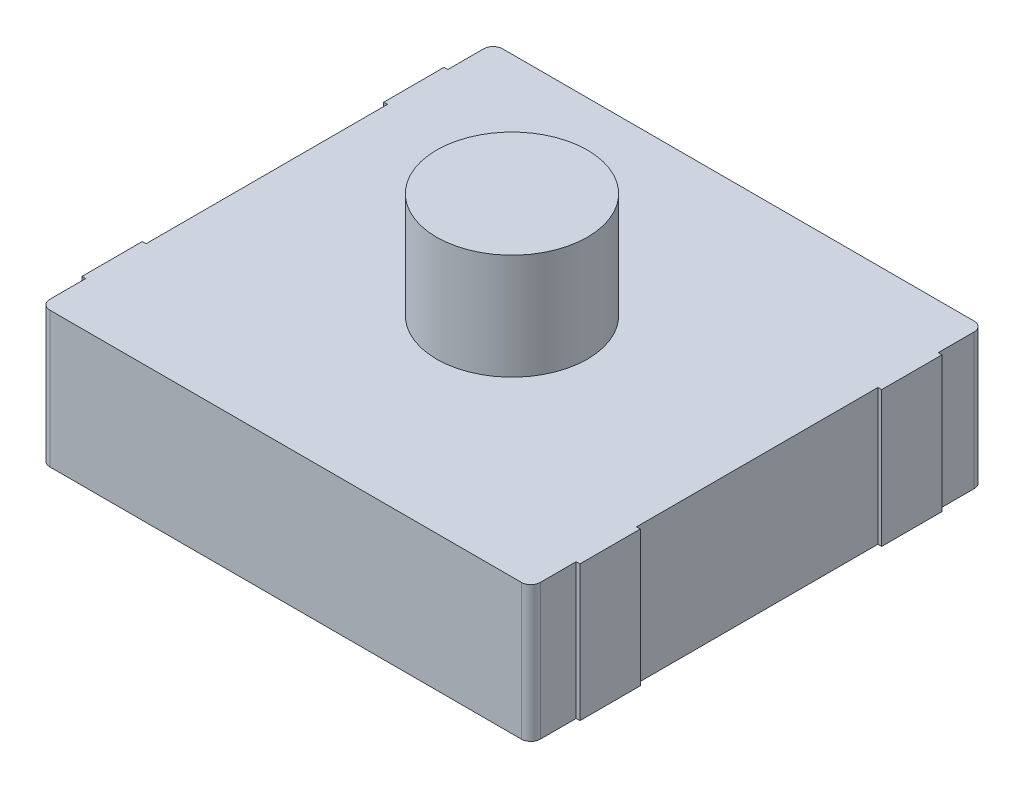
ISO-10303-21;
HEADER;
FILE_DESCRIPTION(('STEP AP214'),'2;1');
FILE_NAME('part.step','',(''),(''),'','','');
FILE_SCHEMA(('AUTOMOTIVE_DESIGN { 1 0 10303 214 1 1 1 1 }'));
ENDSEC;
DATA;
#1=APPLICATION_CONTEXT('core data for automotive mechanical design processes');
#2=APPLICATION_PROTOCOL_DEFINITION('international standard','automotive_design',2000,#1);
#3=PRODUCT_CONTEXT('',#1,'mechanical');
#4=PRODUCT('Part','Part','',(#3));
#5=PRODUCT_RELATED_PRODUCT_CATEGORY('part','',(#4));
#6=PRODUCT_DEFINITION_FORMATION('','',#4);
#7=PRODUCT_DEFINITION_CONTEXT('part definition',#1,'design');
#8=PRODUCT_DEFINITION('design','',#6,#7);
#9=PRODUCT_DEFINITION_SHAPE('','',#8);
#10=(LENGTH_UNIT() NAMED_UNIT(*) SI_UNIT(.MILLI.,.METRE.));
#11=(NAMED_UNIT(*) PLANE_ANGLE_UNIT() SI_UNIT($,.RADIAN.));
#12=(NAMED_UNIT(*) SI_UNIT($,.STERADIAN.) SOLID_ANGLE_UNIT());
#13=UNCERTAINTY_MEASURE_WITH_UNIT(LENGTH_MEASURE(1.E-05),#10,'distance_accuracy_value','');
#14=(GEOMETRIC_REPRESENTATION_CONTEXT(3) GLOBAL_UNCERTAINTY_ASSIGNED_CONTEXT((#13)) GLOBAL_UNIT_ASSIGNED_CONTEXT((#10,
#11,#12)) REPRESENTATION_CONTEXT('',''));
#15=CARTESIAN_POINT('',(0.,0.,0.));
#16=DIRECTION('',(0.,0.,1.));
#17=DIRECTION('',(1.,0.,0.));
#18=AXIS2_PLACEMENT_3D('',#15,#16,#17);
#19=CARTESIAN_POINT('',(0.,1.8,0.));
#20=DIRECTION('',(0.,1.,0.));
#21=DIRECTION('',(0.,0.,1.));
#22=AXIS2_PLACEMENT_3D('',#19,#20,#21);
#23=PLANE('',#22);
#24=DIRECTION('',(0.,0.,-1.));
#25=VECTOR('',#24,1.);
#26=CARTESIAN_POINT('',(3.25,1.8,-3.));
#27=LINE('',#26,#25);
#28=CARTESIAN_POINT('',(3.25,1.8,-2.4));
#29=VERTEX_POINT('',#28);
#30=CARTESIAN_POINT('',(3.25,1.8,-2.875));
#31=VERTEX_POINT('',#30);
#32=EDGE_CURVE('E330',#29,#31,#27,.T.);
#33=ORIENTED_EDGE('',*,*,#32,.T.);
#34=CARTESIAN_POINT('',(3.125,1.8,-2.875));
#35=DIRECTION('',(0.,1.,0.));
#36=DIRECTION('',(0.,0.,1.));
#37=AXIS2_PLACEMENT_3D('',#34,#35,#36);
#38=CIRCLE('',#37,0.125);
#39=CARTESIAN_POINT('',(3.125,1.8,-3.));
#40=VERTEX_POINT('',#39);
#41=EDGE_CURVE('E369',#31,#40,#38,.T.);
#42=ORIENTED_EDGE('',*,*,#41,.T.);
#43=DIRECTION('',(-1.,0.,0.));
#44=VECTOR('',#43,1.);
#45=CARTESIAN_POINT('',(-3.25,1.8,-3.));
#46=LINE('',#45,#44);
#47=CARTESIAN_POINT('',(-3.125,1.8,-3.));
#48=VERTEX_POINT('',#47);
#49=EDGE_CURVE('E333',#40,#48,#46,.T.);
#50=ORIENTED_EDGE('',*,*,#49,.T.);
#51=CARTESIAN_POINT('',(-3.125,1.8,-2.875));
#52=DIRECTION('',(0.,1.,0.));
#53=DIRECTION('',(0.,0.,1.));
#54=AXIS2_PLACEMENT_3D('',#51,#52,#53);
#55=CIRCLE('',#54,0.125);
#56=CARTESIAN_POINT('',(-3.25,1.8,-2.875));
#57=VERTEX_POINT('',#56);
#58=EDGE_CURVE('E367',#48,#57,#55,.T.);
#59=ORIENTED_EDGE('',*,*,#58,.T.);
#60=DIRECTION('',(0.,0.,1.));
#61=VECTOR('',#60,1.);
#62=CARTESIAN_POINT('',(-3.25,1.8,-3.));
#63=LINE('',#62,#61);
#64=CARTESIAN_POINT('',(-3.25,1.8,-2.4));
#65=VERTEX_POINT('',#64);
#66=EDGE_CURVE('E324',#57,#65,#63,.T.);
#67=ORIENTED_EDGE('',*,*,#66,.T.);
#68=DIRECTION('',(1.,0.,0.));
#69=VECTOR('',#68,1.);
#70=CARTESIAN_POINT('',(-3.3,1.8,-2.4));
#71=LINE('',#70,#69);
#72=CARTESIAN_POINT('',(-3.3,1.8,-2.4));
#73=VERTEX_POINT('',#72);
#74=EDGE_CURVE('E272',#73,#65,#71,.T.);
#75=ORIENTED_EDGE('',*,*,#74,.F.);
#76=DIRECTION('',(0.,0.,-1.));
#77=VECTOR('',#76,1.);
#78=CARTESIAN_POINT('',(-3.3,1.8,-1.6));
#79=LINE('',#78,#77);
#80=CARTESIAN_POINT('',(-3.3,1.8,-1.6));
#81=VERTEX_POINT('',#80);
#82=EDGE_CURVE('E281',#81,#73,#79,.T.);
#83=ORIENTED_EDGE('',*,*,#82,.F.);
#84=DIRECTION('',(-1.,0.,0.));
#85=VECTOR('',#84,1.);
#86=CARTESIAN_POINT('',(-3.3,1.8,-1.6));
#87=LINE('',#86,#85);
#88=CARTESIAN_POINT('',(-3.25,1.8,-1.6));
#89=VERTEX_POINT('',#88);
#90=EDGE_CURVE('E280',#89,#81,#87,.T.);
#91=ORIENTED_EDGE('',*,*,#90,.F.);
#92=CARTESIAN_POINT('',(-3.25,1.8,1.6));
#93=VERTEX_POINT('',#92);
#94=EDGE_CURVE('E327',#89,#93,#63,.T.);
#95=ORIENTED_EDGE('',*,*,#94,.T.);
#96=DIRECTION('',(1.,0.,0.));
#97=VECTOR('',#96,1.);
#98=CARTESIAN_POINT('',(-3.3,1.8,1.6));
#99=LINE('',#98,#97);
#100=CARTESIAN_POINT('',(-3.3,1.8,1.6));
#101=VERTEX_POINT('',#100);
#102=EDGE_CURVE('E299',#101,#93,#99,.T.);
#103=ORIENTED_EDGE('',*,*,#102,.F.);
#104=DIRECTION('',(0.,0.,-1.));
#105=VECTOR('',#104,1.);
#106=CARTESIAN_POINT('',(-3.3,1.8,2.4));
#107=LINE('',#106,#105);
#108=CARTESIAN_POINT('',(-3.3,1.8,2.4));
#109=VERTEX_POINT('',#108);
#110=EDGE_CURVE('E308',#109,#101,#107,.T.);
#111=ORIENTED_EDGE('',*,*,#110,.F.);
#112=DIRECTION('',(-1.,0.,0.));
#113=VECTOR('',#112,1.);
#114=CARTESIAN_POINT('',(-3.3,1.8,2.4));
#115=LINE('',#114,#113);
#116=CARTESIAN_POINT('',(-3.25,1.8,2.4));
#117=VERTEX_POINT('',#116);
#118=EDGE_CURVE('E307',#117,#109,#115,.T.);
#119=ORIENTED_EDGE('',*,*,#118,.F.);
#120=CARTESIAN_POINT('',(-3.25,1.8,2.875));
#121=VERTEX_POINT('',#120);
#122=EDGE_CURVE('E328',#117,#121,#63,.T.);
#123=ORIENTED_EDGE('',*,*,#122,.T.);
#124=CARTESIAN_POINT('',(-3.125,1.8,2.875));
#125=DIRECTION('',(0.,1.,0.));
#126=DIRECTION('',(0.,0.,1.));
#127=AXIS2_PLACEMENT_3D('',#124,#125,#126);
#128=CIRCLE('',#127,0.125);
#129=CARTESIAN_POINT('',(-3.125,1.8,3.));
#130=VERTEX_POINT('',#129);
#131=EDGE_CURVE('E57',#121,#130,#128,.T.);
#132=ORIENTED_EDGE('',*,*,#131,.T.);
#133=DIRECTION('',(1.,0.,0.));
#134=VECTOR('',#133,1.);
#135=CARTESIAN_POINT('',(-3.25,1.8,3.));
#136=LINE('',#135,#134);
#137=CARTESIAN_POINT('',(3.125,1.8,3.));
#138=VERTEX_POINT('',#137);
#139=EDGE_CURVE('E326',#130,#138,#136,.T.);
#140=ORIENTED_EDGE('',*,*,#139,.T.);
#141=CARTESIAN_POINT('',(3.125,1.8,2.875));
#142=DIRECTION('',(0.,1.,0.));
#143=DIRECTION('',(0.,0.,1.));
#144=AXIS2_PLACEMENT_3D('',#141,#142,#143);
#145=CIRCLE('',#144,0.125);
#146=CARTESIAN_POINT('',(3.25,1.8,2.875));
#147=VERTEX_POINT('',#146);
#148=EDGE_CURVE('E364',#138,#147,#145,.T.);
#149=ORIENTED_EDGE('',*,*,#148,.T.);
#150=CARTESIAN_POINT('',(3.25,1.8,2.4));
#151=VERTEX_POINT('',#150);
#152=EDGE_CURVE('E331',#147,#151,#27,.T.);
#153=ORIENTED_EDGE('',*,*,#152,.T.);
#154=DIRECTION('',(-1.,0.,0.));
#155=VECTOR('',#154,1.);
#156=CARTESIAN_POINT('',(3.3,1.8,2.4));
#157=LINE('',#156,#155);
#158=CARTESIAN_POINT('',(3.3,1.8,2.4));
#159=VERTEX_POINT('',#158);
#160=EDGE_CURVE('E209',#159,#151,#157,.T.);
#161=ORIENTED_EDGE('',*,*,#160,.F.);
#162=DIRECTION('',(0.,0.,1.));
#163=VECTOR('',#162,1.);
#164=CARTESIAN_POINT('',(3.3,1.8,2.4));
#165=LINE('',#164,#163);
#166=CARTESIAN_POINT('',(3.3,1.8,1.6));
#167=VERTEX_POINT('',#166);
#168=EDGE_CURVE('E206',#167,#159,#165,.T.);
#169=ORIENTED_EDGE('',*,*,#168,.F.);
#170=DIRECTION('',(1.,0.,0.));
#171=VECTOR('',#170,1.);
#172=CARTESIAN_POINT('',(3.3,1.8,1.6));
#173=LINE('',#172,#171);
#174=CARTESIAN_POINT('',(3.25,1.8,1.6));
#175=VERTEX_POINT('',#174);
#176=EDGE_CURVE('E226',#175,#167,#173,.T.);
#177=ORIENTED_EDGE('',*,*,#176,.F.);
#178=CARTESIAN_POINT('',(3.25,1.8,-1.6));
#179=VERTEX_POINT('',#178);
#180=EDGE_CURVE('E334',#175,#179,#27,.T.);
#181=ORIENTED_EDGE('',*,*,#180,.T.);
#182=DIRECTION('',(-1.,0.,0.));
#183=VECTOR('',#182,1.);
#184=CARTESIAN_POINT('',(3.3,1.8,-1.6));
#185=LINE('',#184,#183);
#186=CARTESIAN_POINT('',(3.3,1.8,-1.6));
#187=VERTEX_POINT('',#186);
#188=EDGE_CURVE('E251',#187,#179,#185,.T.);
#189=ORIENTED_EDGE('',*,*,#188,.F.);
#190=DIRECTION('',(0.,0.,1.));
#191=VECTOR('',#190,1.);
#192=CARTESIAN_POINT('',(3.3,1.8,-1.6));
#193=LINE('',#192,#191);
#194=CARTESIAN_POINT('',(3.3,1.8,-2.4));
#195=VERTEX_POINT('',#194);
#196=EDGE_CURVE('E256',#195,#187,#193,.T.);
#197=ORIENTED_EDGE('',*,*,#196,.F.);
#198=DIRECTION('',(1.,0.,0.));
#199=VECTOR('',#198,1.);
#200=CARTESIAN_POINT('',(3.3,1.8,-2.4));
#201=LINE('',#200,#199);
#202=EDGE_CURVE('E246',#29,#195,#201,.T.);
#203=ORIENTED_EDGE('',*,*,#202,.F.);
#204=EDGE_LOOP('',(#33,#42,#50,#59,#67,#75,#83,#91,#95,#103,#111,#119,#123,#132,#140,#149,#153,
#161,#169,#177,#181,#189,#197,#203));
#205=FACE_BOUND('',#204,.T.);
#206=CARTESIAN_POINT('',(0.,1.8,0.));
#207=DIRECTION('',(0.,1.,0.));
#208=DIRECTION('',(0.,0.,1.));
#209=AXIS2_PLACEMENT_3D('',#206,#207,#208);
#210=CIRCLE('',#209,1.);
#211=CARTESIAN_POINT('',(0.,1.8,1.));
#212=VERTEX_POINT('',#211);
#213=EDGE_CURVE('E232',#212,#212,#210,.T.);
#214=ORIENTED_EDGE('',*,*,#213,.F.);
#215=EDGE_LOOP('',(#214));
#216=FACE_BOUND('',#215,.T.);
#217=ADVANCED_FACE('F35',(#205,#216),#23,.T.);
#218=CARTESIAN_POINT('',(3.25,1.8,-3.));
#219=DIRECTION('',(-1.,0.,0.));
#220=DIRECTION('',(0.,0.,1.));
#221=AXIS2_PLACEMENT_3D('',#218,#219,#220);
#222=PLANE('',#221);
#223=ORIENTED_EDGE('',*,*,#180,.F.);
#224=DIRECTION('',(0.,-1.,0.));
#225=VECTOR('',#224,1.);
#226=CARTESIAN_POINT('',(3.25,1.8,1.6));
#227=LINE('',#226,#225);
#228=CARTESIAN_POINT('',(3.25,0.,1.6));
#229=VERTEX_POINT('',#228);
#230=EDGE_CURVE('E239',#175,#229,#227,.T.);
#231=ORIENTED_EDGE('',*,*,#230,.T.);
#232=DIRECTION('',(0.,0.,-1.));
#233=VECTOR('',#232,1.);
#234=CARTESIAN_POINT('',(3.25,0.,-3.));
#235=LINE('',#234,#233);
#236=CARTESIAN_POINT('',(3.25,0.,-1.6));
#237=VERTEX_POINT('',#236);
#238=EDGE_CURVE('E347',#229,#237,#235,.T.);
#239=ORIENTED_EDGE('',*,*,#238,.T.);
#240=DIRECTION('',(0.,1.,0.));
#241=VECTOR('',#240,1.);
#242=CARTESIAN_POINT('',(3.25,1.8,-1.6));
#243=LINE('',#242,#241);
#244=EDGE_CURVE('E254',#237,#179,#243,.T.);
#245=ORIENTED_EDGE('',*,*,#244,.T.);
#246=EDGE_LOOP('',(#223,#231,#239,#245));
#247=FACE_BOUND('',#246,.T.);
#248=ADVANCED_FACE('F403',(#247),#222,.F.);
#249=CARTESIAN_POINT('',(3.25,0.,-2.4));
#250=VERTEX_POINT('',#249);
#251=CARTESIAN_POINT('',(3.25,0.,-2.875));
#252=VERTEX_POINT('',#251);
#253=EDGE_CURVE('E343',#250,#252,#235,.T.);
#254=ORIENTED_EDGE('',*,*,#253,.T.);
#255=DIRECTION('',(0.,-1.,0.));
#256=VECTOR('',#255,1.);
#257=CARTESIAN_POINT('',(3.25,1.8,-2.875));
#258=LINE('',#257,#256);
#259=EDGE_CURVE('E362',#252,#31,#258,.F.);
#260=ORIENTED_EDGE('',*,*,#259,.T.);
#261=ORIENTED_EDGE('',*,*,#32,.F.);
#262=DIRECTION('',(0.,-1.,0.));
#263=VECTOR('',#262,1.);
#264=CARTESIAN_POINT('',(3.25,1.8,-2.4));
#265=LINE('',#264,#263);
#266=EDGE_CURVE('E266',#29,#250,#265,.T.);
#267=ORIENTED_EDGE('',*,*,#266,.T.);
#268=EDGE_LOOP('',(#254,#260,#261,#267));
#269=FACE_BOUND('',#268,.T.);
#270=ADVANCED_FACE('F410',(#269),#222,.F.);
#271=CARTESIAN_POINT('',(-3.25,1.8,-3.));
#272=DIRECTION('',(1.,0.,0.));
#273=DIRECTION('',(0.,0.,-1.));
#274=AXIS2_PLACEMENT_3D('',#271,#272,#273);
#275=PLANE('',#274);
#276=ORIENTED_EDGE('',*,*,#66,.F.);
#277=DIRECTION('',(0.,-1.,0.));
#278=VECTOR('',#277,1.);
#279=CARTESIAN_POINT('',(-3.25,1.8,-2.875));
#280=LINE('',#279,#278);
#281=CARTESIAN_POINT('',(-3.25,0.,-2.875));
#282=VERTEX_POINT('',#281);
#283=EDGE_CURVE('E371',#57,#282,#280,.T.);
#284=ORIENTED_EDGE('',*,*,#283,.T.);
#285=DIRECTION('',(0.,0.,1.));
#286=VECTOR('',#285,1.);
#287=CARTESIAN_POINT('',(-3.25,0.,-3.));
#288=LINE('',#287,#286);
#289=CARTESIAN_POINT('',(-3.25,0.,-2.4));
#290=VERTEX_POINT('',#289);
#291=EDGE_CURVE('E338',#282,#290,#288,.T.);
#292=ORIENTED_EDGE('',*,*,#291,.T.);
#293=DIRECTION('',(0.,1.,0.));
#294=VECTOR('',#293,1.);
#295=CARTESIAN_POINT('',(-3.25,1.8,-2.4));
#296=LINE('',#295,#294);
#297=EDGE_CURVE('E293',#290,#65,#296,.T.);
#298=ORIENTED_EDGE('',*,*,#297,.T.);
#299=EDGE_LOOP('',(#276,#284,#292,#298));
#300=FACE_BOUND('',#299,.T.);
#301=ADVANCED_FACE('F427',(#300),#275,.F.);
#302=ORIENTED_EDGE('',*,*,#94,.F.);
#303=DIRECTION('',(0.,-1.,0.));
#304=VECTOR('',#303,1.);
#305=CARTESIAN_POINT('',(-3.25,1.8,-1.6));
#306=LINE('',#305,#304);
#307=CARTESIAN_POINT('',(-3.25,0.,-1.6));
#308=VERTEX_POINT('',#307);
#309=EDGE_CURVE('E290',#89,#308,#306,.T.);
#310=ORIENTED_EDGE('',*,*,#309,.T.);
#311=CARTESIAN_POINT('',(-3.25,0.,1.6));
#312=VERTEX_POINT('',#311);
#313=EDGE_CURVE('E341',#308,#312,#288,.T.);
#314=ORIENTED_EDGE('',*,*,#313,.T.);
#315=DIRECTION('',(0.,1.,0.));
#316=VECTOR('',#315,1.);
#317=CARTESIAN_POINT('',(-3.25,1.8,1.6));
#318=LINE('',#317,#316);
#319=EDGE_CURVE('E320',#312,#93,#318,.T.);
#320=ORIENTED_EDGE('',*,*,#319,.T.);
#321=EDGE_LOOP('',(#302,#310,#314,#320));
#322=FACE_BOUND('',#321,.T.);
#323=ADVANCED_FACE('F444',(#322),#275,.F.);
#324=CARTESIAN_POINT('',(-3.25,0.,2.4));
#325=VERTEX_POINT('',#324);
#326=CARTESIAN_POINT('',(-3.25,0.,2.875));
#327=VERTEX_POINT('',#326);
#328=EDGE_CURVE('E323',#325,#327,#288,.T.);
#329=ORIENTED_EDGE('',*,*,#328,.T.);
#330=DIRECTION('',(0.,-1.,0.));
#331=VECTOR('',#330,1.);
#332=CARTESIAN_POINT('',(-3.25,1.8,2.875));
#333=LINE('',#332,#331);
#334=EDGE_CURVE('E43',#327,#121,#333,.F.);
#335=ORIENTED_EDGE('',*,*,#334,.T.);
#336=ORIENTED_EDGE('',*,*,#122,.F.);
#337=DIRECTION('',(0.,-1.,0.));
#338=VECTOR('',#337,1.);
#339=CARTESIAN_POINT('',(-3.25,1.8,2.4));
#340=LINE('',#339,#338);
#341=EDGE_CURVE('E317',#117,#325,#340,.T.);
#342=ORIENTED_EDGE('',*,*,#341,.T.);
#343=EDGE_LOOP('',(#329,#335,#336,#342));
#344=FACE_BOUND('',#343,.T.);
#345=ADVANCED_FACE('F381',(#344),#275,.F.);
#346=CARTESIAN_POINT('',(-3.25,1.8,3.));
#347=DIRECTION('',(0.,0.,-1.));
#348=DIRECTION('',(-1.,0.,0.));
#349=AXIS2_PLACEMENT_3D('',#346,#347,#348);
#350=PLANE('',#349);
#351=ORIENTED_EDGE('',*,*,#139,.F.);
#352=DIRECTION('',(0.,-1.,0.));
#353=VECTOR('',#352,1.);
#354=CARTESIAN_POINT('',(-3.125,1.8,3.));
#355=LINE('',#354,#353);
#356=CARTESIAN_POINT('',(-3.125,0.,3.));
#357=VERTEX_POINT('',#356);
#358=EDGE_CURVE('E375',#130,#357,#355,.T.);
#359=ORIENTED_EDGE('',*,*,#358,.T.);
#360=DIRECTION('',(1.,0.,0.));
#361=VECTOR('',#360,1.);
#362=CARTESIAN_POINT('',(-3.25,0.,3.));
#363=LINE('',#362,#361);
#364=CARTESIAN_POINT('',(3.125,0.,3.));
#365=VERTEX_POINT('',#364);
#366=EDGE_CURVE('E340',#357,#365,#363,.T.);
#367=ORIENTED_EDGE('',*,*,#366,.T.);
#368=DIRECTION('',(0.,-1.,0.));
#369=VECTOR('',#368,1.);
#370=CARTESIAN_POINT('',(3.125,1.8,3.));
#371=LINE('',#370,#369);
#372=EDGE_CURVE('E50',#365,#138,#371,.F.);
#373=ORIENTED_EDGE('',*,*,#372,.T.);
#374=EDGE_LOOP('',(#351,#359,#367,#373));
#375=FACE_BOUND('',#374,.T.);
#376=ADVANCED_FACE('F391',(#375),#350,.F.);
#377=ORIENTED_EDGE('',*,*,#152,.F.);
#378=DIRECTION('',(0.,-1.,0.));
#379=VECTOR('',#378,1.);
#380=CARTESIAN_POINT('',(3.25,1.8,2.875));
#381=LINE('',#380,#379);
#382=CARTESIAN_POINT('',(3.25,0.,2.875));
#383=VERTEX_POINT('',#382);
#384=EDGE_CURVE('E11',#147,#383,#381,.T.);
#385=ORIENTED_EDGE('',*,*,#384,.T.);
#386=CARTESIAN_POINT('',(3.25,0.,2.4));
#387=VERTEX_POINT('',#386);
#388=EDGE_CURVE('E344',#383,#387,#235,.T.);
#389=ORIENTED_EDGE('',*,*,#388,.T.);
#390=DIRECTION('',(0.,1.,0.));
#391=VECTOR('',#390,1.);
#392=CARTESIAN_POINT('',(3.25,1.8,2.4));
#393=LINE('',#392,#391);
#394=EDGE_CURVE('E216',#387,#151,#393,.T.);
#395=ORIENTED_EDGE('',*,*,#394,.T.);
#396=EDGE_LOOP('',(#377,#385,#389,#395));
#397=FACE_BOUND('',#396,.T.);
#398=ADVANCED_FACE('F397',(#397),#222,.F.);
#399=CARTESIAN_POINT('',(-3.25,1.8,-3.));
#400=DIRECTION('',(0.,0.,1.));
#401=DIRECTION('',(1.,0.,0.));
#402=AXIS2_PLACEMENT_3D('',#399,#400,#401);
#403=PLANE('',#402);
#404=ORIENTED_EDGE('',*,*,#49,.F.);
#405=DIRECTION('',(0.,-1.,0.));
#406=VECTOR('',#405,1.);
#407=CARTESIAN_POINT('',(3.125,1.8,-3.));
#408=LINE('',#407,#406);
#409=CARTESIAN_POINT('',(3.125,0.,-3.));
#410=VERTEX_POINT('',#409);
#411=EDGE_CURVE('E351',#40,#410,#408,.T.);
#412=ORIENTED_EDGE('',*,*,#411,.T.);
#413=DIRECTION('',(-1.,0.,0.));
#414=VECTOR('',#413,1.);
#415=CARTESIAN_POINT('',(-3.25,0.,-3.));
#416=LINE('',#415,#414);
#417=CARTESIAN_POINT('',(-3.125,0.,-3.));
#418=VERTEX_POINT('',#417);
#419=EDGE_CURVE('E346',#410,#418,#416,.T.);
#420=ORIENTED_EDGE('',*,*,#419,.T.);
#421=DIRECTION('',(0.,-1.,0.));
#422=VECTOR('',#421,1.);
#423=CARTESIAN_POINT('',(-3.125,1.8,-3.));
#424=LINE('',#423,#422);
#425=EDGE_CURVE('E337',#418,#48,#424,.F.);
#426=ORIENTED_EDGE('',*,*,#425,.T.);
#427=EDGE_LOOP('',(#404,#412,#420,#426));
#428=FACE_BOUND('',#427,.T.);
#429=ADVANCED_FACE('F420',(#428),#403,.F.);
#430=CARTESIAN_POINT('',(0.,0.,0.));
#431=DIRECTION('',(0.,1.,0.));
#432=DIRECTION('',(0.,0.,1.));
#433=AXIS2_PLACEMENT_3D('',#430,#431,#432);
#434=PLANE('',#433);
#435=ORIENTED_EDGE('',*,*,#419,.F.);
#436=CARTESIAN_POINT('',(3.125,0.,-2.875));
#437=DIRECTION('',(0.,1.,0.));
#438=DIRECTION('',(0.,0.,1.));
#439=AXIS2_PLACEMENT_3D('',#436,#437,#438);
#440=CIRCLE('',#439,0.125);
#441=EDGE_CURVE('E360',#410,#252,#440,.F.);
#442=ORIENTED_EDGE('',*,*,#441,.T.);
#443=ORIENTED_EDGE('',*,*,#253,.F.);
#444=DIRECTION('',(1.,0.,0.));
#445=VECTOR('',#444,1.);
#446=CARTESIAN_POINT('',(3.3,0.,-2.4));
#447=LINE('',#446,#445);
#448=CARTESIAN_POINT('',(3.3,0.,-2.4));
#449=VERTEX_POINT('',#448);
#450=EDGE_CURVE('E247',#250,#449,#447,.T.);
#451=ORIENTED_EDGE('',*,*,#450,.T.);
#452=DIRECTION('',(0.,0.,1.));
#453=VECTOR('',#452,1.);
#454=CARTESIAN_POINT('',(3.3,0.,-1.6));
#455=LINE('',#454,#453);
#456=CARTESIAN_POINT('',(3.3,0.,-1.6));
#457=VERTEX_POINT('',#456);
#458=EDGE_CURVE('E243',#449,#457,#455,.T.);
#459=ORIENTED_EDGE('',*,*,#458,.T.);
#460=DIRECTION('',(-1.,0.,0.));
#461=VECTOR('',#460,1.);
#462=CARTESIAN_POINT('',(3.3,0.,-1.6));
#463=LINE('',#462,#461);
#464=EDGE_CURVE('E242',#457,#237,#463,.T.);
#465=ORIENTED_EDGE('',*,*,#464,.T.);
#466=ORIENTED_EDGE('',*,*,#238,.F.);
#467=DIRECTION('',(1.,0.,0.));
#468=VECTOR('',#467,1.);
#469=CARTESIAN_POINT('',(3.3,0.,1.6));
#470=LINE('',#469,#468);
#471=CARTESIAN_POINT('',(3.3,0.,1.6));
#472=VERTEX_POINT('',#471);
#473=EDGE_CURVE('E219',#229,#472,#470,.T.);
#474=ORIENTED_EDGE('',*,*,#473,.T.);
#475=DIRECTION('',(0.,0.,1.));
#476=VECTOR('',#475,1.);
#477=CARTESIAN_POINT('',(3.3,0.,2.4));
#478=LINE('',#477,#476);
#479=CARTESIAN_POINT('',(3.3,0.,2.4));
#480=VERTEX_POINT('',#479);
#481=EDGE_CURVE('E204',#472,#480,#478,.T.);
#482=ORIENTED_EDGE('',*,*,#481,.T.);
#483=DIRECTION('',(-1.,0.,0.));
#484=VECTOR('',#483,1.);
#485=CARTESIAN_POINT('',(3.3,0.,2.4));
#486=LINE('',#485,#484);
#487=EDGE_CURVE('E213',#480,#387,#486,.T.);
#488=ORIENTED_EDGE('',*,*,#487,.T.);
#489=ORIENTED_EDGE('',*,*,#388,.F.);
#490=CARTESIAN_POINT('',(3.125,0.,2.875));
#491=DIRECTION('',(0.,1.,0.));
#492=DIRECTION('',(0.,0.,1.));
#493=AXIS2_PLACEMENT_3D('',#490,#491,#492);
#494=CIRCLE('',#493,0.125);
#495=EDGE_CURVE('E354',#383,#365,#494,.F.);
#496=ORIENTED_EDGE('',*,*,#495,.T.);
#497=ORIENTED_EDGE('',*,*,#366,.F.);
#498=CARTESIAN_POINT('',(-3.125,0.,2.875));
#499=DIRECTION('',(0.,1.,0.));
#500=DIRECTION('',(0.,0.,1.));
#501=AXIS2_PLACEMENT_3D('',#498,#499,#500);
#502=CIRCLE('',#501,0.125);
#503=EDGE_CURVE('E356',#357,#327,#502,.F.);
#504=ORIENTED_EDGE('',*,*,#503,.T.);
#505=ORIENTED_EDGE('',*,*,#328,.F.);
#506=DIRECTION('',(-1.,0.,0.));
#507=VECTOR('',#506,1.);
#508=CARTESIAN_POINT('',(-3.3,0.,2.4));
#509=LINE('',#508,#507);
#510=CARTESIAN_POINT('',(-3.3,0.,2.4));
#511=VERTEX_POINT('',#510);
#512=EDGE_CURVE('E297',#325,#511,#509,.T.);
#513=ORIENTED_EDGE('',*,*,#512,.T.);
#514=DIRECTION('',(0.,0.,-1.));
#515=VECTOR('',#514,1.);
#516=CARTESIAN_POINT('',(-3.3,0.,2.4));
#517=LINE('',#516,#515);
#518=CARTESIAN_POINT('',(-3.3,0.,1.6));
#519=VERTEX_POINT('',#518);
#520=EDGE_CURVE('E296',#511,#519,#517,.T.);
#521=ORIENTED_EDGE('',*,*,#520,.T.);
#522=DIRECTION('',(1.,0.,0.));
#523=VECTOR('',#522,1.);
#524=CARTESIAN_POINT('',(-3.3,0.,1.6));
#525=LINE('',#524,#523);
#526=EDGE_CURVE('E300',#519,#312,#525,.T.);
#527=ORIENTED_EDGE('',*,*,#526,.T.);
#528=ORIENTED_EDGE('',*,*,#313,.F.);
#529=DIRECTION('',(-1.,0.,0.));
#530=VECTOR('',#529,1.);
#531=CARTESIAN_POINT('',(-3.3,0.,-1.6));
#532=LINE('',#531,#530);
#533=CARTESIAN_POINT('',(-3.3,0.,-1.6));
#534=VERTEX_POINT('',#533);
#535=EDGE_CURVE('E270',#308,#534,#532,.T.);
#536=ORIENTED_EDGE('',*,*,#535,.T.);
#537=DIRECTION('',(0.,0.,-1.));
#538=VECTOR('',#537,1.);
#539=CARTESIAN_POINT('',(-3.3,0.,-1.6));
#540=LINE('',#539,#538);
#541=CARTESIAN_POINT('',(-3.3,0.,-2.4));
#542=VERTEX_POINT('',#541);
#543=EDGE_CURVE('E269',#534,#542,#540,.T.);
#544=ORIENTED_EDGE('',*,*,#543,.T.);
#545=DIRECTION('',(1.,0.,0.));
#546=VECTOR('',#545,1.);
#547=CARTESIAN_POINT('',(-3.3,0.,-2.4));
#548=LINE('',#547,#546);
#549=EDGE_CURVE('E273',#542,#290,#548,.T.);
#550=ORIENTED_EDGE('',*,*,#549,.T.);
#551=ORIENTED_EDGE('',*,*,#291,.F.);
#552=CARTESIAN_POINT('',(-3.125,0.,-2.875));
#553=DIRECTION('',(0.,1.,0.));
#554=DIRECTION('',(0.,0.,1.));
#555=AXIS2_PLACEMENT_3D('',#552,#553,#554);
#556=CIRCLE('',#555,0.125);
#557=EDGE_CURVE('E358',#282,#418,#556,.F.);
#558=ORIENTED_EDGE('',*,*,#557,.T.);
#559=EDGE_LOOP('',(#435,#442,#443,#451,#459,#465,#466,#474,#482,#488,#489,#496,#497,#504,#505,
#513,#521,#527,#528,#536,#544,#550,#551,#558));
#560=FACE_BOUND('',#559,.T.);
#561=ADVANCED_FACE('F223',(#560),#434,.F.);
#562=CARTESIAN_POINT('',(-3.3,3.08062484748657,1.6));
#563=DIRECTION('',(0.,0.,-1.));
#564=DIRECTION('',(-1.,0.,0.));
#565=AXIS2_PLACEMENT_3D('',#562,#563,#564);
#566=PLANE('',#565);
#567=ORIENTED_EDGE('',*,*,#319,.F.);
#568=ORIENTED_EDGE('',*,*,#526,.F.);
#569=DIRECTION('',(0.,-1.,0.));
#570=VECTOR('',#569,1.);
#571=CARTESIAN_POINT('',(-3.3,3.08062484748657,1.6));
#572=LINE('',#571,#570);
#573=EDGE_CURVE('E311',#101,#519,#572,.T.);
#574=ORIENTED_EDGE('',*,*,#573,.F.);
#575=ORIENTED_EDGE('',*,*,#102,.T.);
#576=EDGE_LOOP('',(#567,#568,#574,#575));
#577=FACE_BOUND('',#576,.T.);
#578=ADVANCED_FACE('F448',(#577),#566,.T.);
#579=CARTESIAN_POINT('',(-3.3,3.08062484748657,2.4));
#580=DIRECTION('',(0.,0.,1.));
#581=DIRECTION('',(1.,0.,0.));
#582=AXIS2_PLACEMENT_3D('',#579,#580,#581);
#583=PLANE('',#582);
#584=ORIENTED_EDGE('',*,*,#341,.F.);
#585=ORIENTED_EDGE('',*,*,#118,.T.);
#586=DIRECTION('',(0.,-1.,0.));
#587=VECTOR('',#586,1.);
#588=CARTESIAN_POINT('',(-3.3,3.08062484748657,2.4));
#589=LINE('',#588,#587);
#590=EDGE_CURVE('E312',#109,#511,#589,.T.);
#591=ORIENTED_EDGE('',*,*,#590,.T.);
#592=ORIENTED_EDGE('',*,*,#512,.F.);
#593=EDGE_LOOP('',(#584,#585,#591,#592));
#594=FACE_BOUND('',#593,.T.);
#595=ADVANCED_FACE('F455',(#594),#583,.T.);
#596=CARTESIAN_POINT('',(-3.3,3.08062484748657,2.4));
#597=DIRECTION('',(-1.,0.,0.));
#598=DIRECTION('',(0.,0.,1.));
#599=AXIS2_PLACEMENT_3D('',#596,#597,#598);
#600=PLANE('',#599);
#601=ORIENTED_EDGE('',*,*,#590,.F.);
#602=ORIENTED_EDGE('',*,*,#110,.T.);
#603=ORIENTED_EDGE('',*,*,#573,.T.);
#604=ORIENTED_EDGE('',*,*,#520,.F.);
#605=EDGE_LOOP('',(#601,#602,#603,#604));
#606=FACE_BOUND('',#605,.T.);
#607=ADVANCED_FACE('F453',(#606),#600,.T.);
#608=CARTESIAN_POINT('',(-3.3,3.08062484748657,-2.4));
#609=DIRECTION('',(0.,0.,-1.));
#610=DIRECTION('',(-1.,0.,0.));
#611=AXIS2_PLACEMENT_3D('',#608,#609,#610);
#612=PLANE('',#611);
#613=ORIENTED_EDGE('',*,*,#297,.F.);
#614=ORIENTED_EDGE('',*,*,#549,.F.);
#615=DIRECTION('',(0.,-1.,0.));
#616=VECTOR('',#615,1.);
#617=CARTESIAN_POINT('',(-3.3,3.08062484748657,-2.4));
#618=LINE('',#617,#616);
#619=EDGE_CURVE('E284',#73,#542,#618,.T.);
#620=ORIENTED_EDGE('',*,*,#619,.F.);
#621=ORIENTED_EDGE('',*,*,#74,.T.);
#622=EDGE_LOOP('',(#613,#614,#620,#621));
#623=FACE_BOUND('',#622,.T.);
#624=ADVANCED_FACE('F432',(#623),#612,.T.);
#625=CARTESIAN_POINT('',(-3.3,3.08062484748657,-1.6));
#626=DIRECTION('',(0.,0.,1.));
#627=DIRECTION('',(1.,0.,0.));
#628=AXIS2_PLACEMENT_3D('',#625,#626,#627);
#629=PLANE('',#628);
#630=ORIENTED_EDGE('',*,*,#309,.F.);
#631=ORIENTED_EDGE('',*,*,#90,.T.);
#632=DIRECTION('',(0.,-1.,0.));
#633=VECTOR('',#632,1.);
#634=CARTESIAN_POINT('',(-3.3,3.08062484748657,-1.6));
#635=LINE('',#634,#633);
#636=EDGE_CURVE('E285',#81,#534,#635,.T.);
#637=ORIENTED_EDGE('',*,*,#636,.T.);
#638=ORIENTED_EDGE('',*,*,#535,.F.);
#639=EDGE_LOOP('',(#630,#631,#637,#638));
#640=FACE_BOUND('',#639,.T.);
#641=ADVANCED_FACE('F644',(#640),#629,.T.);
#642=CARTESIAN_POINT('',(-3.3,3.08062484748657,-1.6));
#643=DIRECTION('',(-1.,0.,0.));
#644=DIRECTION('',(0.,0.,1.));
#645=AXIS2_PLACEMENT_3D('',#642,#643,#644);
#646=PLANE('',#645);
#647=ORIENTED_EDGE('',*,*,#636,.F.);
#648=ORIENTED_EDGE('',*,*,#82,.T.);
#649=ORIENTED_EDGE('',*,*,#619,.T.);
#650=ORIENTED_EDGE('',*,*,#543,.F.);
#651=EDGE_LOOP('',(#647,#648,#649,#650));
#652=FACE_BOUND('',#651,.T.);
#653=ADVANCED_FACE('F438',(#652),#646,.T.);
#654=CARTESIAN_POINT('',(3.3,3.08062484748657,-2.4));
#655=DIRECTION('',(0.,0.,-1.));
#656=DIRECTION('',(-1.,0.,0.));
#657=AXIS2_PLACEMENT_3D('',#654,#655,#656);
#658=PLANE('',#657);
#659=ORIENTED_EDGE('',*,*,#266,.F.);
#660=ORIENTED_EDGE('',*,*,#202,.T.);
#661=DIRECTION('',(0.,-1.,0.));
#662=VECTOR('',#661,1.);
#663=CARTESIAN_POINT('',(3.3,3.08062484748657,-2.4));
#664=LINE('',#663,#662);
#665=EDGE_CURVE('E259',#195,#449,#664,.T.);
#666=ORIENTED_EDGE('',*,*,#665,.T.);
#667=ORIENTED_EDGE('',*,*,#450,.F.);
#668=EDGE_LOOP('',(#659,#660,#666,#667));
#669=FACE_BOUND('',#668,.T.);
#670=ADVANCED_FACE('F625',(#669),#658,.T.);
#671=CARTESIAN_POINT('',(3.3,3.08062484748657,-1.6));
#672=DIRECTION('',(0.,0.,1.));
#673=DIRECTION('',(1.,0.,0.));
#674=AXIS2_PLACEMENT_3D('',#671,#672,#673);
#675=PLANE('',#674);
#676=ORIENTED_EDGE('',*,*,#244,.F.);
#677=ORIENTED_EDGE('',*,*,#464,.F.);
#678=DIRECTION('',(0.,-1.,0.));
#679=VECTOR('',#678,1.);
#680=CARTESIAN_POINT('',(3.3,3.08062484748657,-1.6));
#681=LINE('',#680,#679);
#682=EDGE_CURVE('E255',#187,#457,#681,.T.);
#683=ORIENTED_EDGE('',*,*,#682,.F.);
#684=ORIENTED_EDGE('',*,*,#188,.T.);
#685=EDGE_LOOP('',(#676,#677,#683,#684));
#686=FACE_BOUND('',#685,.T.);
#687=ADVANCED_FACE('F615',(#686),#675,.T.);
#688=CARTESIAN_POINT('',(3.3,3.08062484748657,-1.6));
#689=DIRECTION('',(1.,0.,0.));
#690=DIRECTION('',(0.,0.,-1.));
#691=AXIS2_PLACEMENT_3D('',#688,#689,#690);
#692=PLANE('',#691);
#693=ORIENTED_EDGE('',*,*,#665,.F.);
#694=ORIENTED_EDGE('',*,*,#196,.T.);
#695=ORIENTED_EDGE('',*,*,#682,.T.);
#696=ORIENTED_EDGE('',*,*,#458,.F.);
#697=EDGE_LOOP('',(#693,#694,#695,#696));
#698=FACE_BOUND('',#697,.T.);
#699=ADVANCED_FACE('F606',(#698),#692,.T.);
#700=CARTESIAN_POINT('',(3.3,3.08062484748657,1.6));
#701=DIRECTION('',(0.,0.,-1.));
#702=DIRECTION('',(-1.,0.,0.));
#703=AXIS2_PLACEMENT_3D('',#700,#701,#702);
#704=PLANE('',#703);
#705=ORIENTED_EDGE('',*,*,#230,.F.);
#706=ORIENTED_EDGE('',*,*,#176,.T.);
#707=DIRECTION('',(0.,-1.,0.));
#708=VECTOR('',#707,1.);
#709=CARTESIAN_POINT('',(3.3,3.08062484748657,1.6));
#710=LINE('',#709,#708);
#711=EDGE_CURVE('E228',#167,#472,#710,.T.);
#712=ORIENTED_EDGE('',*,*,#711,.T.);
#713=ORIENTED_EDGE('',*,*,#473,.F.);
#714=EDGE_LOOP('',(#705,#706,#712,#713));
#715=FACE_BOUND('',#714,.T.);
#716=ADVANCED_FACE('F401',(#715),#704,.T.);
#717=CARTESIAN_POINT('',(3.3,3.08062484748657,2.4));
#718=DIRECTION('',(0.,0.,1.));
#719=DIRECTION('',(1.,0.,0.));
#720=AXIS2_PLACEMENT_3D('',#717,#718,#719);
#721=PLANE('',#720);
#722=ORIENTED_EDGE('',*,*,#394,.F.);
#723=ORIENTED_EDGE('',*,*,#487,.F.);
#724=DIRECTION('',(0.,-1.,0.));
#725=VECTOR('',#724,1.);
#726=CARTESIAN_POINT('',(3.3,3.08062484748657,2.4));
#727=LINE('',#726,#725);
#728=EDGE_CURVE('E199',#159,#480,#727,.T.);
#729=ORIENTED_EDGE('',*,*,#728,.F.);
#730=ORIENTED_EDGE('',*,*,#160,.T.);
#731=EDGE_LOOP('',(#722,#723,#729,#730));
#732=FACE_BOUND('',#731,.T.);
#733=ADVANCED_FACE('F214',(#732),#721,.T.);
#734=CARTESIAN_POINT('',(3.3,3.08062484748657,2.4));
#735=DIRECTION('',(1.,0.,0.));
#736=DIRECTION('',(0.,0.,-1.));
#737=AXIS2_PLACEMENT_3D('',#734,#735,#736);
#738=PLANE('',#737);
#739=ORIENTED_EDGE('',*,*,#711,.F.);
#740=ORIENTED_EDGE('',*,*,#168,.T.);
#741=ORIENTED_EDGE('',*,*,#728,.T.);
#742=ORIENTED_EDGE('',*,*,#481,.F.);
#743=EDGE_LOOP('',(#739,#740,#741,#742));
#744=FACE_BOUND('',#743,.T.);
#745=ADVANCED_FACE('F202',(#744),#738,.T.);
#746=CARTESIAN_POINT('',(0.,3.2,0.));
#747=DIRECTION('',(0.,-1.,0.));
#748=DIRECTION('',(0.,0.,-1.));
#749=AXIS2_PLACEMENT_3D('',#746,#747,#748);
#750=CYLINDRICAL_SURFACE('',#749,1.);
#751=CARTESIAN_POINT('',(0.,3.2,0.));
#752=DIRECTION('',(0.,1.,0.));
#753=DIRECTION('',(0.,0.,1.));
#754=AXIS2_PLACEMENT_3D('',#751,#752,#753);
#755=CIRCLE('',#754,1.);
#756=CARTESIAN_POINT('',(0.,3.2,1.));
#757=VERTEX_POINT('',#756);
#758=EDGE_CURVE('E220',#757,#757,#755,.T.);
#759=ORIENTED_EDGE('',*,*,#758,.F.);
#760=EDGE_LOOP('',(#759));
#761=FACE_BOUND('',#760,.T.);
#762=ORIENTED_EDGE('',*,*,#213,.T.);
#763=EDGE_LOOP('',(#762));
#764=FACE_BOUND('',#763,.T.);
#765=ADVANCED_FACE('F571',(#761,#764),#750,.T.);
#766=CARTESIAN_POINT('',(0.,3.2,0.));
#767=DIRECTION('',(0.,1.,0.));
#768=DIRECTION('',(0.,0.,1.));
#769=AXIS2_PLACEMENT_3D('',#766,#767,#768);
#770=PLANE('',#769);
#771=ORIENTED_EDGE('',*,*,#758,.T.);
#772=EDGE_LOOP('',(#771));
#773=FACE_BOUND('',#772,.T.);
#774=ADVANCED_FACE('F482',(#773),#770,.T.);
#775=CARTESIAN_POINT('',(3.125,1.8,-2.875));
#776=DIRECTION('',(0.,-1.,0.));
#777=DIRECTION('',(0.,0.,-1.));
#778=AXIS2_PLACEMENT_3D('',#775,#776,#777);
#779=CYLINDRICAL_SURFACE('',#778,0.125);
#780=ORIENTED_EDGE('',*,*,#41,.F.);
#781=ORIENTED_EDGE('',*,*,#259,.F.);
#782=ORIENTED_EDGE('',*,*,#441,.F.);
#783=ORIENTED_EDGE('',*,*,#411,.F.);
#784=EDGE_LOOP('',(#780,#781,#782,#783));
#785=FACE_BOUND('',#784,.T.);
#786=ADVANCED_FACE('F414',(#785),#779,.T.);
#787=CARTESIAN_POINT('',(-3.125,1.8,-2.875));
#788=DIRECTION('',(0.,-1.,0.));
#789=DIRECTION('',(0.,0.,-1.));
#790=AXIS2_PLACEMENT_3D('',#787,#788,#789);
#791=CYLINDRICAL_SURFACE('',#790,0.125);
#792=ORIENTED_EDGE('',*,*,#58,.F.);
#793=ORIENTED_EDGE('',*,*,#425,.F.);
#794=ORIENTED_EDGE('',*,*,#557,.F.);
#795=ORIENTED_EDGE('',*,*,#283,.F.);
#796=EDGE_LOOP('',(#792,#793,#794,#795));
#797=FACE_BOUND('',#796,.T.);
#798=ADVANCED_FACE('F423',(#797),#791,.T.);
#799=CARTESIAN_POINT('',(-3.125,1.8,2.875));
#800=DIRECTION('',(0.,-1.,0.));
#801=DIRECTION('',(0.,0.,-1.));
#802=AXIS2_PLACEMENT_3D('',#799,#800,#801);
#803=CYLINDRICAL_SURFACE('',#802,0.125);
#804=ORIENTED_EDGE('',*,*,#131,.F.);
#805=ORIENTED_EDGE('',*,*,#334,.F.);
#806=ORIENTED_EDGE('',*,*,#503,.F.);
#807=ORIENTED_EDGE('',*,*,#358,.F.);
#808=EDGE_LOOP('',(#804,#805,#806,#807));
#809=FACE_BOUND('',#808,.T.);
#810=ADVANCED_FACE('F389',(#809),#803,.T.);
#811=CARTESIAN_POINT('',(3.125,1.8,2.875));
#812=DIRECTION('',(0.,-1.,0.));
#813=DIRECTION('',(0.,0.,-1.));
#814=AXIS2_PLACEMENT_3D('',#811,#812,#813);
#815=CYLINDRICAL_SURFACE('',#814,0.125);
#816=ORIENTED_EDGE('',*,*,#148,.F.);
#817=ORIENTED_EDGE('',*,*,#372,.F.);
#818=ORIENTED_EDGE('',*,*,#495,.F.);
#819=ORIENTED_EDGE('',*,*,#384,.F.);
#820=EDGE_LOOP('',(#816,#817,#818,#819));
#821=FACE_BOUND('',#820,.T.);
#822=ADVANCED_FACE('F37',(#821),#815,.T.);
#823=CLOSED_SHELL('',(#217,#248,#270,#301,#323,#345,#376,#398,#429,#561,#578,#595,#607,#624,
#641,#653,#670,#687,#699,#716,#733,#745,#765,#774,#786,#798,#810,#822));
#824=MANIFOLD_SOLID_BREP('B2',#823);
#825=ADVANCED_BREP_SHAPE_REPRESENTATION('',(#18,#824),#14);
#826=SHAPE_DEFINITION_REPRESENTATION(#9,#825);
ENDSEC;
END-ISO-10303-21;
